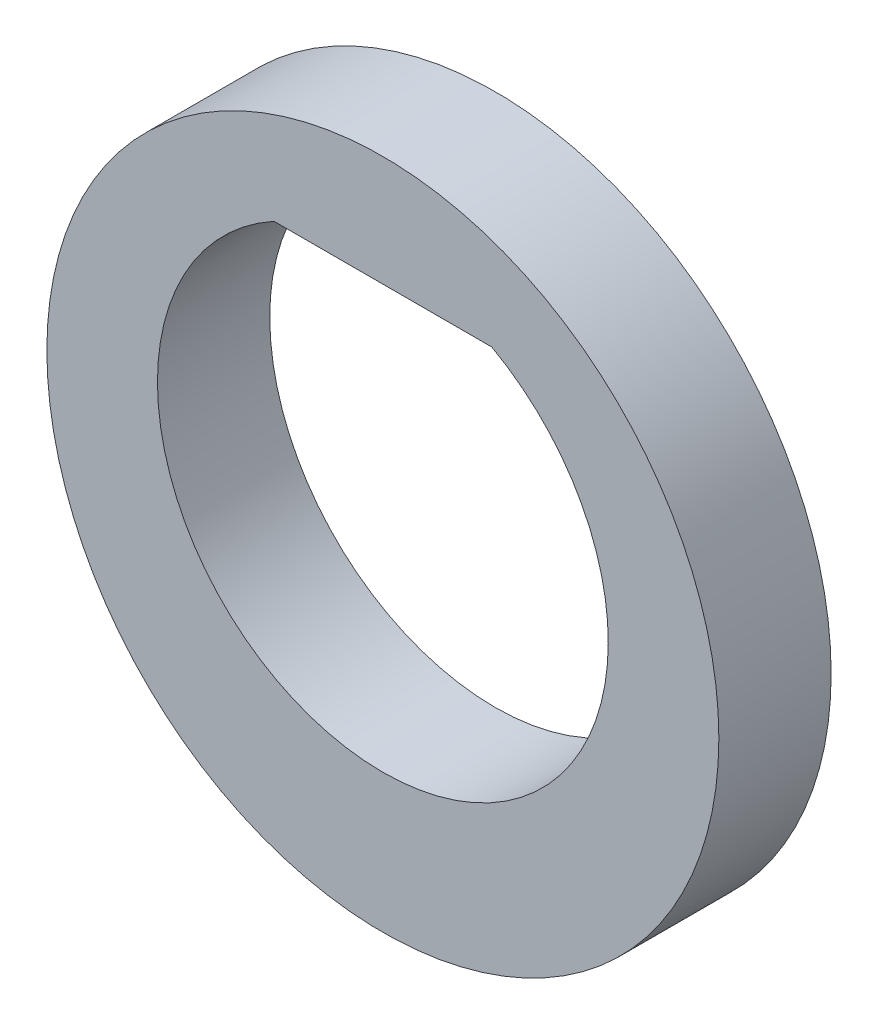
ISO-10303-21;
HEADER;
FILE_DESCRIPTION(('STEP AP214'),'2;1');
FILE_NAME('part.step','',(''),(''),'','','');
FILE_SCHEMA(('AUTOMOTIVE_DESIGN { 1 0 10303 214 1 1 1 1 }'));
ENDSEC;
DATA;
#1=APPLICATION_CONTEXT('core data for automotive mechanical design processes');
#2=APPLICATION_PROTOCOL_DEFINITION('international standard','automotive_design',2000,#1);
#3=PRODUCT_CONTEXT('',#1,'mechanical');
#4=PRODUCT('Part','Part','',(#3));
#5=PRODUCT_RELATED_PRODUCT_CATEGORY('part','',(#4));
#6=PRODUCT_DEFINITION_FORMATION('','',#4);
#7=PRODUCT_DEFINITION_CONTEXT('part definition',#1,'design');
#8=PRODUCT_DEFINITION('design','',#6,#7);
#9=PRODUCT_DEFINITION_SHAPE('','',#8);
#10=(LENGTH_UNIT() NAMED_UNIT(*) SI_UNIT(.MILLI.,.METRE.));
#11=(NAMED_UNIT(*) PLANE_ANGLE_UNIT() SI_UNIT($,.RADIAN.));
#12=(NAMED_UNIT(*) SI_UNIT($,.STERADIAN.) SOLID_ANGLE_UNIT());
#13=UNCERTAINTY_MEASURE_WITH_UNIT(LENGTH_MEASURE(1.E-05),#10,'distance_accuracy_value','');
#14=(GEOMETRIC_REPRESENTATION_CONTEXT(3) GLOBAL_UNCERTAINTY_ASSIGNED_CONTEXT((#13)) GLOBAL_UNIT_ASSIGNED_CONTEXT((#10,
#11,#12)) REPRESENTATION_CONTEXT('',''));
#15=CARTESIAN_POINT('',(0.,0.,0.));
#16=DIRECTION('',(0.,0.,1.));
#17=DIRECTION('',(1.,0.,0.));
#18=AXIS2_PLACEMENT_3D('',#15,#16,#17);
#19=CARTESIAN_POINT('',(0.,-0.5,2.));
#20=DIRECTION('',(0.,0.,-1.));
#21=DIRECTION('',(-1.,0.,0.));
#22=AXIS2_PLACEMENT_3D('',#19,#20,#21);
#23=CYLINDRICAL_SURFACE('',#22,4.015);
#24=CARTESIAN_POINT('',(0.,-0.5,0.));
#25=DIRECTION('',(0.,0.,1.));
#26=DIRECTION('',(1.,0.,0.));
#27=AXIS2_PLACEMENT_3D('',#24,#25,#26);
#28=CIRCLE('',#27,4.015);
#29=CARTESIAN_POINT('',(-1.94036079119323,3.015,0.));
#30=VERTEX_POINT('',#29);
#31=CARTESIAN_POINT('',(1.94036079119323,3.015,0.));
#32=VERTEX_POINT('',#31);
#33=EDGE_CURVE('E70',#30,#32,#28,.T.);
#34=ORIENTED_EDGE('',*,*,#33,.F.);
#35=DIRECTION('',(0.,0.,-1.));
#36=VECTOR('',#35,1.);
#37=CARTESIAN_POINT('',(-1.94036079119323,3.015,2.));
#38=LINE('',#37,#36);
#39=CARTESIAN_POINT('',(-1.94036079119323,3.015,2.));
#40=VERTEX_POINT('',#39);
#41=EDGE_CURVE('E11',#40,#30,#38,.T.);
#42=ORIENTED_EDGE('',*,*,#41,.F.);
#43=CARTESIAN_POINT('',(0.,-0.5,2.));
#44=DIRECTION('',(0.,0.,1.));
#45=DIRECTION('',(1.,0.,0.));
#46=AXIS2_PLACEMENT_3D('',#43,#44,#45);
#47=CIRCLE('',#46,4.015);
#48=CARTESIAN_POINT('',(1.94036079119323,3.015,2.));
#49=VERTEX_POINT('',#48);
#50=EDGE_CURVE('E71',#40,#49,#47,.T.);
#51=ORIENTED_EDGE('',*,*,#50,.T.);
#52=DIRECTION('',(0.,0.,-1.));
#53=VECTOR('',#52,1.);
#54=CARTESIAN_POINT('',(1.94036079119323,3.015,2.));
#55=LINE('',#54,#53);
#56=EDGE_CURVE('E50',#49,#32,#55,.T.);
#57=ORIENTED_EDGE('',*,*,#56,.T.);
#58=EDGE_LOOP('',(#34,#42,#51,#57));
#59=FACE_BOUND('',#58,.T.);
#60=ADVANCED_FACE('F41',(#59),#23,.F.);
#61=CARTESIAN_POINT('',(0.,3.015,2.));
#62=DIRECTION('',(0.,1.,0.));
#63=DIRECTION('',(0.,0.,1.));
#64=AXIS2_PLACEMENT_3D('',#61,#62,#63);
#65=PLANE('',#64);
#66=DIRECTION('',(1.,0.,0.));
#67=VECTOR('',#66,1.);
#68=CARTESIAN_POINT('',(0.,3.015,0.));
#69=LINE('',#68,#67);
#70=EDGE_CURVE('E74',#30,#32,#69,.T.);
#71=ORIENTED_EDGE('',*,*,#70,.T.);
#72=ORIENTED_EDGE('',*,*,#56,.F.);
#73=DIRECTION('',(1.,0.,0.));
#74=VECTOR('',#73,1.);
#75=CARTESIAN_POINT('',(0.,3.015,2.));
#76=LINE('',#75,#74);
#77=EDGE_CURVE('E57',#40,#49,#76,.T.);
#78=ORIENTED_EDGE('',*,*,#77,.F.);
#79=ORIENTED_EDGE('',*,*,#41,.T.);
#80=EDGE_LOOP('',(#71,#72,#78,#79));
#81=FACE_BOUND('',#80,.T.);
#82=ADVANCED_FACE('F75',(#81),#65,.F.);
#83=CARTESIAN_POINT('',(0.,-1.,2.));
#84=DIRECTION('',(0.,0.,-1.));
#85=DIRECTION('',(-1.,0.,0.));
#86=AXIS2_PLACEMENT_3D('',#83,#84,#85);
#87=CYLINDRICAL_SURFACE('',#86,5.985);
#88=CARTESIAN_POINT('',(0.,-1.,2.));
#89=DIRECTION('',(0.,0.,1.));
#90=DIRECTION('',(1.,0.,0.));
#91=AXIS2_PLACEMENT_3D('',#88,#89,#90);
#92=CIRCLE('',#91,5.985);
#93=CARTESIAN_POINT('',(5.985,-1.,2.));
#94=VERTEX_POINT('',#93);
#95=EDGE_CURVE('E73',#94,#94,#92,.T.);
#96=ORIENTED_EDGE('',*,*,#95,.F.);
#97=EDGE_LOOP('',(#96));
#98=FACE_BOUND('',#97,.T.);
#99=CARTESIAN_POINT('',(0.,-1.,0.));
#100=DIRECTION('',(0.,0.,1.));
#101=DIRECTION('',(1.,0.,0.));
#102=AXIS2_PLACEMENT_3D('',#99,#100,#101);
#103=CIRCLE('',#102,5.985);
#104=CARTESIAN_POINT('',(5.985,-1.,0.));
#105=VERTEX_POINT('',#104);
#106=EDGE_CURVE('E78',#105,#105,#103,.T.);
#107=ORIENTED_EDGE('',*,*,#106,.T.);
#108=EDGE_LOOP('',(#107));
#109=FACE_BOUND('',#108,.T.);
#110=ADVANCED_FACE('F100',(#98,#109),#87,.T.);
#111=CARTESIAN_POINT('',(0.,0.,2.));
#112=DIRECTION('',(0.,0.,1.));
#113=DIRECTION('',(1.,0.,0.));
#114=AXIS2_PLACEMENT_3D('',#111,#112,#113);
#115=PLANE('',#114);
#116=ORIENTED_EDGE('',*,*,#50,.F.);
#117=ORIENTED_EDGE('',*,*,#77,.T.);
#118=EDGE_LOOP('',(#116,#117));
#119=FACE_BOUND('',#118,.T.);
#120=ORIENTED_EDGE('',*,*,#95,.T.);
#121=EDGE_LOOP('',(#120));
#122=FACE_BOUND('',#121,.T.);
#123=ADVANCED_FACE('F98',(#119,#122),#115,.T.);
#124=CARTESIAN_POINT('',(0.,0.,0.));
#125=DIRECTION('',(0.,0.,1.));
#126=DIRECTION('',(1.,0.,0.));
#127=AXIS2_PLACEMENT_3D('',#124,#125,#126);
#128=PLANE('',#127);
#129=ORIENTED_EDGE('',*,*,#33,.T.);
#130=ORIENTED_EDGE('',*,*,#70,.F.);
#131=EDGE_LOOP('',(#129,#130));
#132=FACE_BOUND('',#131,.T.);
#133=ORIENTED_EDGE('',*,*,#106,.F.);
#134=EDGE_LOOP('',(#133));
#135=FACE_BOUND('',#134,.T.);
#136=ADVANCED_FACE('F80',(#132,#135),#128,.F.);
#137=CLOSED_SHELL('',(#60,#82,#110,#123,#136));
#138=MANIFOLD_SOLID_BREP('B2',#137);
#139=ADVANCED_BREP_SHAPE_REPRESENTATION('',(#18,#138),#14);
#140=SHAPE_DEFINITION_REPRESENTATION(#9,#139);
ENDSEC;
END-ISO-10303-21;
